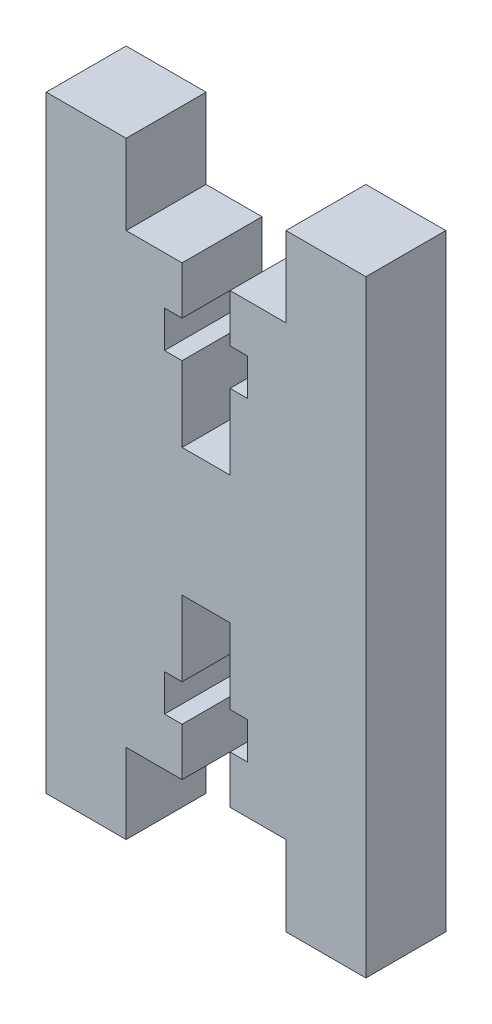
ISO-10303-21;
HEADER;
FILE_DESCRIPTION(('STEP AP214'),'2;1');
FILE_NAME('part.step','',(''),(''),'','','');
FILE_SCHEMA(('AUTOMOTIVE_DESIGN { 1 0 10303 214 1 1 1 1 }'));
ENDSEC;
DATA;
#1=APPLICATION_CONTEXT('core data for automotive mechanical design processes');
#2=APPLICATION_PROTOCOL_DEFINITION('international standard','automotive_design',2000,#1);
#3=PRODUCT_CONTEXT('',#1,'mechanical');
#4=PRODUCT('Part','Part','',(#3));
#5=PRODUCT_RELATED_PRODUCT_CATEGORY('part','',(#4));
#6=PRODUCT_DEFINITION_FORMATION('','',#4);
#7=PRODUCT_DEFINITION_CONTEXT('part definition',#1,'design');
#8=PRODUCT_DEFINITION('design','',#6,#7);
#9=PRODUCT_DEFINITION_SHAPE('','',#8);
#10=(LENGTH_UNIT() NAMED_UNIT(*) SI_UNIT(.MILLI.,.METRE.));
#11=(NAMED_UNIT(*) PLANE_ANGLE_UNIT() SI_UNIT($,.RADIAN.));
#12=(NAMED_UNIT(*) SI_UNIT($,.STERADIAN.) SOLID_ANGLE_UNIT());
#13=UNCERTAINTY_MEASURE_WITH_UNIT(LENGTH_MEASURE(1.E-05),#10,'distance_accuracy_value','');
#14=(GEOMETRIC_REPRESENTATION_CONTEXT(3) GLOBAL_UNCERTAINTY_ASSIGNED_CONTEXT((#13)) GLOBAL_UNIT_ASSIGNED_CONTEXT((#10,
#11,#12)) REPRESENTATION_CONTEXT('',''));
#15=CARTESIAN_POINT('',(0.,0.,0.));
#16=DIRECTION('',(0.,0.,1.));
#17=DIRECTION('',(1.,0.,0.));
#18=AXIS2_PLACEMENT_3D('',#15,#16,#17);
#19=CARTESIAN_POINT('',(0.,11.,5.));
#20=DIRECTION('',(0.,-1.,0.));
#21=DIRECTION('',(1.,0.,0.));
#22=AXIS2_PLACEMENT_3D('',#19,#20,#21);
#23=PLANE('',#22);
#24=DIRECTION('',(-1.,0.,0.));
#25=VECTOR('',#24,1.);
#26=CARTESIAN_POINT('',(0.,11.,0.));
#27=LINE('',#26,#25);
#28=CARTESIAN_POINT('',(-1.5,11.,0.));
#29=VERTEX_POINT('',#28);
#30=CARTESIAN_POINT('',(-2.6,11.,0.));
#31=VERTEX_POINT('',#30);
#32=EDGE_CURVE('E308',#29,#31,#27,.T.);
#33=ORIENTED_EDGE('',*,*,#32,.F.);
#34=DIRECTION('',(0.,0.,-1.));
#35=VECTOR('',#34,1.);
#36=CARTESIAN_POINT('',(-1.5,11.,5.));
#37=LINE('',#36,#35);
#38=CARTESIAN_POINT('',(-1.5,11.,5.));
#39=VERTEX_POINT('',#38);
#40=EDGE_CURVE('E11',#39,#29,#37,.T.);
#41=ORIENTED_EDGE('',*,*,#40,.F.);
#42=DIRECTION('',(-1.,0.,0.));
#43=VECTOR('',#42,1.);
#44=CARTESIAN_POINT('',(0.,11.,5.));
#45=LINE('',#44,#43);
#46=CARTESIAN_POINT('',(-2.6,11.,5.));
#47=VERTEX_POINT('',#46);
#48=EDGE_CURVE('E437',#39,#47,#45,.T.);
#49=ORIENTED_EDGE('',*,*,#48,.T.);
#50=DIRECTION('',(0.,0.,-1.));
#51=VECTOR('',#50,1.);
#52=CARTESIAN_POINT('',(-2.6,11.,5.));
#53=LINE('',#52,#51);
#54=EDGE_CURVE('E58',#47,#31,#53,.T.);
#55=ORIENTED_EDGE('',*,*,#54,.T.);
#56=EDGE_LOOP('',(#33,#41,#49,#55));
#57=FACE_BOUND('',#56,.T.);
#58=ADVANCED_FACE('F41',(#57),#23,.T.);
#59=CARTESIAN_POINT('',(-1.5,0.,5.));
#60=DIRECTION('',(-1.,0.,0.));
#61=DIRECTION('',(0.,-1.,0.));
#62=AXIS2_PLACEMENT_3D('',#59,#60,#61);
#63=PLANE('',#62);
#64=DIRECTION('',(0.,1.,0.));
#65=VECTOR('',#64,1.);
#66=CARTESIAN_POINT('',(-1.5,0.,0.));
#67=LINE('',#66,#65);
#68=CARTESIAN_POINT('',(-1.5,14.,0.));
#69=VERTEX_POINT('',#68);
#70=EDGE_CURVE('E311',#29,#69,#67,.T.);
#71=ORIENTED_EDGE('',*,*,#70,.T.);
#72=DIRECTION('',(0.,0.,-1.));
#73=VECTOR('',#72,1.);
#74=CARTESIAN_POINT('',(-1.5,14.,5.));
#75=LINE('',#74,#73);
#76=CARTESIAN_POINT('',(-1.5,14.,5.));
#77=VERTEX_POINT('',#76);
#78=EDGE_CURVE('E50',#77,#69,#75,.T.);
#79=ORIENTED_EDGE('',*,*,#78,.F.);
#80=DIRECTION('',(0.,1.,0.));
#81=VECTOR('',#80,1.);
#82=CARTESIAN_POINT('',(-1.5,0.,5.));
#83=LINE('',#82,#81);
#84=EDGE_CURVE('E571',#39,#77,#83,.T.);
#85=ORIENTED_EDGE('',*,*,#84,.F.);
#86=ORIENTED_EDGE('',*,*,#40,.T.);
#87=EDGE_LOOP('',(#71,#79,#85,#86));
#88=FACE_BOUND('',#87,.T.);
#89=ADVANCED_FACE('F689',(#88),#63,.F.);
#90=CARTESIAN_POINT('',(0.,14.,5.));
#91=DIRECTION('',(0.,-1.,0.));
#92=DIRECTION('',(1.,0.,0.));
#93=AXIS2_PLACEMENT_3D('',#90,#91,#92);
#94=PLANE('',#93);
#95=DIRECTION('',(-1.,0.,0.));
#96=VECTOR('',#95,1.);
#97=CARTESIAN_POINT('',(0.,14.,0.));
#98=LINE('',#97,#96);
#99=CARTESIAN_POINT('',(-5.,14.,0.));
#100=VERTEX_POINT('',#99);
#101=EDGE_CURVE('E314',#69,#100,#98,.T.);
#102=ORIENTED_EDGE('',*,*,#101,.T.);
#103=DIRECTION('',(0.,0.,-1.));
#104=VECTOR('',#103,1.);
#105=CARTESIAN_POINT('',(-5.,14.,5.));
#106=LINE('',#105,#104);
#107=CARTESIAN_POINT('',(-5.,14.,5.));
#108=VERTEX_POINT('',#107);
#109=EDGE_CURVE('E540',#108,#100,#106,.T.);
#110=ORIENTED_EDGE('',*,*,#109,.F.);
#111=DIRECTION('',(-1.,0.,0.));
#112=VECTOR('',#111,1.);
#113=CARTESIAN_POINT('',(0.,14.,5.));
#114=LINE('',#113,#112);
#115=EDGE_CURVE('E550',#77,#108,#114,.T.);
#116=ORIENTED_EDGE('',*,*,#115,.F.);
#117=ORIENTED_EDGE('',*,*,#78,.T.);
#118=EDGE_LOOP('',(#102,#110,#116,#117));
#119=FACE_BOUND('',#118,.T.);
#120=ADVANCED_FACE('F548',(#119),#94,.F.);
#121=CARTESIAN_POINT('',(-4.99999999999999,0.,5.));
#122=DIRECTION('',(1.,0.,0.));
#123=DIRECTION('',(0.,1.,0.));
#124=AXIS2_PLACEMENT_3D('',#121,#122,#123);
#125=PLANE('',#124);
#126=DIRECTION('',(0.,-1.,0.));
#127=VECTOR('',#126,1.);
#128=CARTESIAN_POINT('',(-4.99999999999999,0.,0.));
#129=LINE('',#128,#127);
#130=CARTESIAN_POINT('',(-5.,19.,0.));
#131=VERTEX_POINT('',#130);
#132=EDGE_CURVE('E318',#131,#100,#129,.T.);
#133=ORIENTED_EDGE('',*,*,#132,.F.);
#134=DIRECTION('',(0.,0.,-1.));
#135=VECTOR('',#134,1.);
#136=CARTESIAN_POINT('',(-5.,19.,5.));
#137=LINE('',#136,#135);
#138=CARTESIAN_POINT('',(-5.,19.,5.));
#139=VERTEX_POINT('',#138);
#140=EDGE_CURVE('E537',#139,#131,#137,.T.);
#141=ORIENTED_EDGE('',*,*,#140,.F.);
#142=DIRECTION('',(0.,-1.,0.));
#143=VECTOR('',#142,1.);
#144=CARTESIAN_POINT('',(-4.99999999999999,0.,5.));
#145=LINE('',#144,#143);
#146=EDGE_CURVE('E563',#139,#108,#145,.T.);
#147=ORIENTED_EDGE('',*,*,#146,.T.);
#148=ORIENTED_EDGE('',*,*,#109,.T.);
#149=EDGE_LOOP('',(#133,#141,#147,#148));
#150=FACE_BOUND('',#149,.T.);
#151=ADVANCED_FACE('F559',(#150),#125,.T.);
#152=CARTESIAN_POINT('',(0.,19.,5.));
#153=DIRECTION('',(0.,-1.,0.));
#154=DIRECTION('',(0.,0.,-1.));
#155=AXIS2_PLACEMENT_3D('',#152,#153,#154);
#156=PLANE('',#155);
#157=DIRECTION('',(-1.,0.,0.));
#158=VECTOR('',#157,1.);
#159=CARTESIAN_POINT('',(0.,19.,0.));
#160=LINE('',#159,#158);
#161=CARTESIAN_POINT('',(-10.,19.,0.));
#162=VERTEX_POINT('',#161);
#163=EDGE_CURVE('E322',#131,#162,#160,.T.);
#164=ORIENTED_EDGE('',*,*,#163,.T.);
#165=DIRECTION('',(0.,0.,-1.));
#166=VECTOR('',#165,1.);
#167=CARTESIAN_POINT('',(-10.,19.,5.));
#168=LINE('',#167,#166);
#169=CARTESIAN_POINT('',(-10.,19.,5.));
#170=VERTEX_POINT('',#169);
#171=EDGE_CURVE('E533',#170,#162,#168,.T.);
#172=ORIENTED_EDGE('',*,*,#171,.F.);
#173=DIRECTION('',(-1.,0.,0.));
#174=VECTOR('',#173,1.);
#175=CARTESIAN_POINT('',(0.,19.,5.));
#176=LINE('',#175,#174);
#177=EDGE_CURVE('E565',#139,#170,#176,.T.);
#178=ORIENTED_EDGE('',*,*,#177,.F.);
#179=ORIENTED_EDGE('',*,*,#140,.T.);
#180=EDGE_LOOP('',(#164,#172,#178,#179));
#181=FACE_BOUND('',#180,.T.);
#182=ADVANCED_FACE('F700',(#181),#156,.F.);
#183=CARTESIAN_POINT('',(-10.,0.,5.));
#184=DIRECTION('',(1.,0.,0.));
#185=DIRECTION('',(0.,0.,-1.));
#186=AXIS2_PLACEMENT_3D('',#183,#184,#185);
#187=PLANE('',#186);
#188=DIRECTION('',(0.,-1.,0.));
#189=VECTOR('',#188,1.);
#190=CARTESIAN_POINT('',(-10.,0.,0.));
#191=LINE('',#190,#189);
#192=CARTESIAN_POINT('',(-10.,-19.,0.));
#193=VERTEX_POINT('',#192);
#194=EDGE_CURVE('E325',#162,#193,#191,.T.);
#195=ORIENTED_EDGE('',*,*,#194,.T.);
#196=DIRECTION('',(0.,0.,-1.));
#197=VECTOR('',#196,1.);
#198=CARTESIAN_POINT('',(-10.,-19.,5.));
#199=LINE('',#198,#197);
#200=CARTESIAN_POINT('',(-10.,-19.,5.));
#201=VERTEX_POINT('',#200);
#202=EDGE_CURVE('E530',#201,#193,#199,.T.);
#203=ORIENTED_EDGE('',*,*,#202,.F.);
#204=DIRECTION('',(0.,-1.,0.));
#205=VECTOR('',#204,1.);
#206=CARTESIAN_POINT('',(-10.,0.,5.));
#207=LINE('',#206,#205);
#208=EDGE_CURVE('E569',#170,#201,#207,.T.);
#209=ORIENTED_EDGE('',*,*,#208,.F.);
#210=ORIENTED_EDGE('',*,*,#171,.T.);
#211=EDGE_LOOP('',(#195,#203,#209,#210));
#212=FACE_BOUND('',#211,.T.);
#213=ADVANCED_FACE('F703',(#212),#187,.F.);
#214=CARTESIAN_POINT('',(0.,-19.,5.));
#215=DIRECTION('',(0.,-1.,0.));
#216=DIRECTION('',(0.,0.,-1.));
#217=AXIS2_PLACEMENT_3D('',#214,#215,#216);
#218=PLANE('',#217);
#219=DIRECTION('',(-1.,0.,0.));
#220=VECTOR('',#219,1.);
#221=CARTESIAN_POINT('',(0.,-19.,0.));
#222=LINE('',#221,#220);
#223=CARTESIAN_POINT('',(-5.,-19.,0.));
#224=VERTEX_POINT('',#223);
#225=EDGE_CURVE('E329',#224,#193,#222,.T.);
#226=ORIENTED_EDGE('',*,*,#225,.F.);
#227=DIRECTION('',(0.,0.,-1.));
#228=VECTOR('',#227,1.);
#229=CARTESIAN_POINT('',(-5.,-19.,5.));
#230=LINE('',#229,#228);
#231=CARTESIAN_POINT('',(-5.,-19.,5.));
#232=VERTEX_POINT('',#231);
#233=EDGE_CURVE('E527',#232,#224,#230,.T.);
#234=ORIENTED_EDGE('',*,*,#233,.F.);
#235=DIRECTION('',(-1.,0.,0.));
#236=VECTOR('',#235,1.);
#237=CARTESIAN_POINT('',(0.,-19.,5.));
#238=LINE('',#237,#236);
#239=EDGE_CURVE('E577',#232,#201,#238,.T.);
#240=ORIENTED_EDGE('',*,*,#239,.T.);
#241=ORIENTED_EDGE('',*,*,#202,.T.);
#242=EDGE_LOOP('',(#226,#234,#240,#241));
#243=FACE_BOUND('',#242,.T.);
#244=ADVANCED_FACE('F707',(#243),#218,.T.);
#245=CARTESIAN_POINT('',(-5.,0.,5.));
#246=DIRECTION('',(-1.,0.,0.));
#247=DIRECTION('',(0.,-1.,0.));
#248=AXIS2_PLACEMENT_3D('',#245,#246,#247);
#249=PLANE('',#248);
#250=DIRECTION('',(0.,1.,0.));
#251=VECTOR('',#250,1.);
#252=CARTESIAN_POINT('',(-5.,0.,0.));
#253=LINE('',#252,#251);
#254=CARTESIAN_POINT('',(-5.,-14.,0.));
#255=VERTEX_POINT('',#254);
#256=EDGE_CURVE('E333',#224,#255,#253,.T.);
#257=ORIENTED_EDGE('',*,*,#256,.T.);
#258=DIRECTION('',(0.,0.,-1.));
#259=VECTOR('',#258,1.);
#260=CARTESIAN_POINT('',(-5.,-14.,5.));
#261=LINE('',#260,#259);
#262=CARTESIAN_POINT('',(-5.,-14.,5.));
#263=VERTEX_POINT('',#262);
#264=EDGE_CURVE('E524',#263,#255,#261,.T.);
#265=ORIENTED_EDGE('',*,*,#264,.F.);
#266=DIRECTION('',(0.,1.,0.));
#267=VECTOR('',#266,1.);
#268=CARTESIAN_POINT('',(-5.,0.,5.));
#269=LINE('',#268,#267);
#270=EDGE_CURVE('E581',#232,#263,#269,.T.);
#271=ORIENTED_EDGE('',*,*,#270,.F.);
#272=ORIENTED_EDGE('',*,*,#233,.T.);
#273=EDGE_LOOP('',(#257,#265,#271,#272));
#274=FACE_BOUND('',#273,.T.);
#275=ADVANCED_FACE('F711',(#274),#249,.F.);
#276=CARTESIAN_POINT('',(0.,-14.,5.));
#277=DIRECTION('',(0.,-1.,0.));
#278=DIRECTION('',(1.,0.,0.));
#279=AXIS2_PLACEMENT_3D('',#276,#277,#278);
#280=PLANE('',#279);
#281=DIRECTION('',(-1.,0.,0.));
#282=VECTOR('',#281,1.);
#283=CARTESIAN_POINT('',(0.,-14.,0.));
#284=LINE('',#283,#282);
#285=CARTESIAN_POINT('',(-1.5,-14.,0.));
#286=VERTEX_POINT('',#285);
#287=EDGE_CURVE('E337',#286,#255,#284,.T.);
#288=ORIENTED_EDGE('',*,*,#287,.F.);
#289=DIRECTION('',(0.,0.,-1.));
#290=VECTOR('',#289,1.);
#291=CARTESIAN_POINT('',(-1.5,-14.,5.));
#292=LINE('',#291,#290);
#293=CARTESIAN_POINT('',(-1.5,-14.,5.));
#294=VERTEX_POINT('',#293);
#295=EDGE_CURVE('E521',#294,#286,#292,.T.);
#296=ORIENTED_EDGE('',*,*,#295,.F.);
#297=DIRECTION('',(-1.,0.,0.));
#298=VECTOR('',#297,1.);
#299=CARTESIAN_POINT('',(0.,-14.,5.));
#300=LINE('',#299,#298);
#301=EDGE_CURVE('E584',#294,#263,#300,.T.);
#302=ORIENTED_EDGE('',*,*,#301,.T.);
#303=ORIENTED_EDGE('',*,*,#264,.T.);
#304=EDGE_LOOP('',(#288,#296,#302,#303));
#305=FACE_BOUND('',#304,.T.);
#306=ADVANCED_FACE('F715',(#305),#280,.T.);
#307=CARTESIAN_POINT('',(-1.5,0.,5.));
#308=DIRECTION('',(1.,0.,0.));
#309=DIRECTION('',(0.,1.,0.));
#310=AXIS2_PLACEMENT_3D('',#307,#308,#309);
#311=PLANE('',#310);
#312=DIRECTION('',(0.,-1.,0.));
#313=VECTOR('',#312,1.);
#314=CARTESIAN_POINT('',(-1.5,0.,0.));
#315=LINE('',#314,#313);
#316=CARTESIAN_POINT('',(-1.5,-11.,0.));
#317=VERTEX_POINT('',#316);
#318=EDGE_CURVE('E341',#317,#286,#315,.T.);
#319=ORIENTED_EDGE('',*,*,#318,.F.);
#320=DIRECTION('',(0.,0.,-1.));
#321=VECTOR('',#320,1.);
#322=CARTESIAN_POINT('',(-1.5,-11.,5.));
#323=LINE('',#322,#321);
#324=CARTESIAN_POINT('',(-1.5,-11.,5.));
#325=VERTEX_POINT('',#324);
#326=EDGE_CURVE('E518',#325,#317,#323,.T.);
#327=ORIENTED_EDGE('',*,*,#326,.F.);
#328=DIRECTION('',(0.,-1.,0.));
#329=VECTOR('',#328,1.);
#330=CARTESIAN_POINT('',(-1.5,0.,5.));
#331=LINE('',#330,#329);
#332=EDGE_CURVE('E588',#325,#294,#331,.T.);
#333=ORIENTED_EDGE('',*,*,#332,.T.);
#334=ORIENTED_EDGE('',*,*,#295,.T.);
#335=EDGE_LOOP('',(#319,#327,#333,#334));
#336=FACE_BOUND('',#335,.T.);
#337=ADVANCED_FACE('F719',(#336),#311,.T.);
#338=CARTESIAN_POINT('',(0.,-11.,5.));
#339=DIRECTION('',(0.,-1.,0.));
#340=DIRECTION('',(1.,0.,0.));
#341=AXIS2_PLACEMENT_3D('',#338,#339,#340);
#342=PLANE('',#341);
#343=DIRECTION('',(-1.,0.,0.));
#344=VECTOR('',#343,1.);
#345=CARTESIAN_POINT('',(0.,-11.,0.));
#346=LINE('',#345,#344);
#347=CARTESIAN_POINT('',(-2.6,-11.,0.));
#348=VERTEX_POINT('',#347);
#349=EDGE_CURVE('E345',#317,#348,#346,.T.);
#350=ORIENTED_EDGE('',*,*,#349,.T.);
#351=DIRECTION('',(0.,0.,-1.));
#352=VECTOR('',#351,1.);
#353=CARTESIAN_POINT('',(-2.6,-11.,5.));
#354=LINE('',#353,#352);
#355=CARTESIAN_POINT('',(-2.6,-11.,5.));
#356=VERTEX_POINT('',#355);
#357=EDGE_CURVE('E514',#356,#348,#354,.T.);
#358=ORIENTED_EDGE('',*,*,#357,.F.);
#359=DIRECTION('',(-1.,0.,0.));
#360=VECTOR('',#359,1.);
#361=CARTESIAN_POINT('',(0.,-11.,5.));
#362=LINE('',#361,#360);
#363=EDGE_CURVE('E592',#325,#356,#362,.T.);
#364=ORIENTED_EDGE('',*,*,#363,.F.);
#365=ORIENTED_EDGE('',*,*,#326,.T.);
#366=EDGE_LOOP('',(#350,#358,#364,#365));
#367=FACE_BOUND('',#366,.T.);
#368=ADVANCED_FACE('F723',(#367),#342,.F.);
#369=CARTESIAN_POINT('',(-2.60000000000001,0.,5.));
#370=DIRECTION('',(-1.,0.,0.));
#371=DIRECTION('',(0.,-1.,0.));
#372=AXIS2_PLACEMENT_3D('',#369,#370,#371);
#373=PLANE('',#372);
#374=DIRECTION('',(0.,1.,0.));
#375=VECTOR('',#374,1.);
#376=CARTESIAN_POINT('',(-2.60000000000001,0.,0.));
#377=LINE('',#376,#375);
#378=CARTESIAN_POINT('',(-2.6,-8.69999999999999,0.));
#379=VERTEX_POINT('',#378);
#380=EDGE_CURVE('E348',#348,#379,#377,.T.);
#381=ORIENTED_EDGE('',*,*,#380,.T.);
#382=DIRECTION('',(0.,0.,-1.));
#383=VECTOR('',#382,1.);
#384=CARTESIAN_POINT('',(-2.6,-8.69999999999999,5.));
#385=LINE('',#384,#383);
#386=CARTESIAN_POINT('',(-2.6,-8.69999999999999,5.));
#387=VERTEX_POINT('',#386);
#388=EDGE_CURVE('E510',#387,#379,#385,.T.);
#389=ORIENTED_EDGE('',*,*,#388,.F.);
#390=DIRECTION('',(0.,1.,0.));
#391=VECTOR('',#390,1.);
#392=CARTESIAN_POINT('',(-2.60000000000001,0.,5.));
#393=LINE('',#392,#391);
#394=EDGE_CURVE('E595',#356,#387,#393,.T.);
#395=ORIENTED_EDGE('',*,*,#394,.F.);
#396=ORIENTED_EDGE('',*,*,#357,.T.);
#397=EDGE_LOOP('',(#381,#389,#395,#396));
#398=FACE_BOUND('',#397,.T.);
#399=ADVANCED_FACE('F727',(#398),#373,.F.);
#400=CARTESIAN_POINT('',(0.,-8.7,5.));
#401=DIRECTION('',(0.,1.,0.));
#402=DIRECTION('',(-1.,0.,0.));
#403=AXIS2_PLACEMENT_3D('',#400,#401,#402);
#404=PLANE('',#403);
#405=DIRECTION('',(1.,0.,0.));
#406=VECTOR('',#405,1.);
#407=CARTESIAN_POINT('',(0.,-8.7,0.));
#408=LINE('',#407,#406);
#409=CARTESIAN_POINT('',(-1.5,-8.7,0.));
#410=VERTEX_POINT('',#409);
#411=EDGE_CURVE('E351',#379,#410,#408,.T.);
#412=ORIENTED_EDGE('',*,*,#411,.T.);
#413=DIRECTION('',(0.,0.,-1.));
#414=VECTOR('',#413,1.);
#415=CARTESIAN_POINT('',(-1.5,-8.7,5.));
#416=LINE('',#415,#414);
#417=CARTESIAN_POINT('',(-1.5,-8.7,5.));
#418=VERTEX_POINT('',#417);
#419=EDGE_CURVE('E507',#418,#410,#416,.T.);
#420=ORIENTED_EDGE('',*,*,#419,.F.);
#421=DIRECTION('',(1.,0.,0.));
#422=VECTOR('',#421,1.);
#423=CARTESIAN_POINT('',(0.,-8.7,5.));
#424=LINE('',#423,#422);
#425=EDGE_CURVE('E598',#387,#418,#424,.T.);
#426=ORIENTED_EDGE('',*,*,#425,.F.);
#427=ORIENTED_EDGE('',*,*,#388,.T.);
#428=EDGE_LOOP('',(#412,#420,#426,#427));
#429=FACE_BOUND('',#428,.T.);
#430=ADVANCED_FACE('F731',(#429),#404,.F.);
#431=CARTESIAN_POINT('',(-1.5,0.,5.));
#432=DIRECTION('',(1.,0.,0.));
#433=DIRECTION('',(0.,1.,0.));
#434=AXIS2_PLACEMENT_3D('',#431,#432,#433);
#435=PLANE('',#434);
#436=DIRECTION('',(0.,-1.,0.));
#437=VECTOR('',#436,1.);
#438=CARTESIAN_POINT('',(-1.5,0.,0.));
#439=LINE('',#438,#437);
#440=CARTESIAN_POINT('',(-1.5,-3.99999999999999,0.));
#441=VERTEX_POINT('',#440);
#442=EDGE_CURVE('E355',#441,#410,#439,.T.);
#443=ORIENTED_EDGE('',*,*,#442,.F.);
#444=DIRECTION('',(0.,0.,-1.));
#445=VECTOR('',#444,1.);
#446=CARTESIAN_POINT('',(-1.5,-3.99999999999999,5.));
#447=LINE('',#446,#445);
#448=CARTESIAN_POINT('',(-1.5,-3.99999999999999,5.));
#449=VERTEX_POINT('',#448);
#450=EDGE_CURVE('E504',#449,#441,#447,.T.);
#451=ORIENTED_EDGE('',*,*,#450,.F.);
#452=DIRECTION('',(0.,-1.,0.));
#453=VECTOR('',#452,1.);
#454=CARTESIAN_POINT('',(-1.5,0.,5.));
#455=LINE('',#454,#453);
#456=EDGE_CURVE('E601',#449,#418,#455,.T.);
#457=ORIENTED_EDGE('',*,*,#456,.T.);
#458=ORIENTED_EDGE('',*,*,#419,.T.);
#459=EDGE_LOOP('',(#443,#451,#457,#458));
#460=FACE_BOUND('',#459,.T.);
#461=ADVANCED_FACE('F735',(#460),#435,.T.);
#462=CARTESIAN_POINT('',(0.,-3.99999999999999,5.));
#463=DIRECTION('',(0.,-1.,0.));
#464=DIRECTION('',(0.,0.,-1.));
#465=AXIS2_PLACEMENT_3D('',#462,#463,#464);
#466=PLANE('',#465);
#467=DIRECTION('',(-1.,0.,0.));
#468=VECTOR('',#467,1.);
#469=CARTESIAN_POINT('',(0.,-3.99999999999999,0.));
#470=LINE('',#469,#468);
#471=CARTESIAN_POINT('',(1.5,-3.99999999999999,0.));
#472=VERTEX_POINT('',#471);
#473=EDGE_CURVE('E359',#472,#441,#470,.T.);
#474=ORIENTED_EDGE('',*,*,#473,.F.);
#475=DIRECTION('',(0.,0.,-1.));
#476=VECTOR('',#475,1.);
#477=CARTESIAN_POINT('',(1.5,-3.99999999999999,5.));
#478=LINE('',#477,#476);
#479=CARTESIAN_POINT('',(1.5,-3.99999999999999,5.));
#480=VERTEX_POINT('',#479);
#481=EDGE_CURVE('E501',#480,#472,#478,.T.);
#482=ORIENTED_EDGE('',*,*,#481,.F.);
#483=DIRECTION('',(-1.,0.,0.));
#484=VECTOR('',#483,1.);
#485=CARTESIAN_POINT('',(0.,-3.99999999999999,5.));
#486=LINE('',#485,#484);
#487=EDGE_CURVE('E605',#480,#449,#486,.T.);
#488=ORIENTED_EDGE('',*,*,#487,.T.);
#489=ORIENTED_EDGE('',*,*,#450,.T.);
#490=EDGE_LOOP('',(#474,#482,#488,#489));
#491=FACE_BOUND('',#490,.T.);
#492=ADVANCED_FACE('F739',(#491),#466,.T.);
#493=CARTESIAN_POINT('',(1.5,0.,5.));
#494=DIRECTION('',(-1.,0.,0.));
#495=DIRECTION('',(0.,-1.,0.));
#496=AXIS2_PLACEMENT_3D('',#493,#494,#495);
#497=PLANE('',#496);
#498=DIRECTION('',(0.,1.,0.));
#499=VECTOR('',#498,1.);
#500=CARTESIAN_POINT('',(1.5,0.,0.));
#501=LINE('',#500,#499);
#502=CARTESIAN_POINT('',(1.5,-8.7,0.));
#503=VERTEX_POINT('',#502);
#504=EDGE_CURVE('E363',#503,#472,#501,.T.);
#505=ORIENTED_EDGE('',*,*,#504,.F.);
#506=DIRECTION('',(0.,0.,-1.));
#507=VECTOR('',#506,1.);
#508=CARTESIAN_POINT('',(1.5,-8.7,5.));
#509=LINE('',#508,#507);
#510=CARTESIAN_POINT('',(1.5,-8.7,5.));
#511=VERTEX_POINT('',#510);
#512=EDGE_CURVE('E498',#511,#503,#509,.T.);
#513=ORIENTED_EDGE('',*,*,#512,.F.);
#514=DIRECTION('',(0.,1.,0.));
#515=VECTOR('',#514,1.);
#516=CARTESIAN_POINT('',(1.5,0.,5.));
#517=LINE('',#516,#515);
#518=EDGE_CURVE('E609',#511,#480,#517,.T.);
#519=ORIENTED_EDGE('',*,*,#518,.T.);
#520=ORIENTED_EDGE('',*,*,#481,.T.);
#521=EDGE_LOOP('',(#505,#513,#519,#520));
#522=FACE_BOUND('',#521,.T.);
#523=ADVANCED_FACE('F743',(#522),#497,.T.);
#524=CARTESIAN_POINT('',(0.,-8.7,5.));
#525=DIRECTION('',(0.,1.,0.));
#526=DIRECTION('',(-1.,0.,0.));
#527=AXIS2_PLACEMENT_3D('',#524,#525,#526);
#528=PLANE('',#527);
#529=DIRECTION('',(1.,0.,0.));
#530=VECTOR('',#529,1.);
#531=CARTESIAN_POINT('',(0.,-8.7,0.));
#532=LINE('',#531,#530);
#533=CARTESIAN_POINT('',(2.6,-8.69999999999999,0.));
#534=VERTEX_POINT('',#533);
#535=EDGE_CURVE('E367',#503,#534,#532,.T.);
#536=ORIENTED_EDGE('',*,*,#535,.T.);
#537=DIRECTION('',(0.,0.,-1.));
#538=VECTOR('',#537,1.);
#539=CARTESIAN_POINT('',(2.6,-8.69999999999999,5.));
#540=LINE('',#539,#538);
#541=CARTESIAN_POINT('',(2.6,-8.69999999999999,5.));
#542=VERTEX_POINT('',#541);
#543=EDGE_CURVE('E494',#542,#534,#540,.T.);
#544=ORIENTED_EDGE('',*,*,#543,.F.);
#545=DIRECTION('',(1.,0.,0.));
#546=VECTOR('',#545,1.);
#547=CARTESIAN_POINT('',(0.,-8.7,5.));
#548=LINE('',#547,#546);
#549=EDGE_CURVE('E613',#511,#542,#548,.T.);
#550=ORIENTED_EDGE('',*,*,#549,.F.);
#551=ORIENTED_EDGE('',*,*,#512,.T.);
#552=EDGE_LOOP('',(#536,#544,#550,#551));
#553=FACE_BOUND('',#552,.T.);
#554=ADVANCED_FACE('F747',(#553),#528,.F.);
#555=CARTESIAN_POINT('',(2.60000000000001,0.,5.));
#556=DIRECTION('',(1.,0.,0.));
#557=DIRECTION('',(0.,1.,0.));
#558=AXIS2_PLACEMENT_3D('',#555,#556,#557);
#559=PLANE('',#558);
#560=DIRECTION('',(0.,-1.,0.));
#561=VECTOR('',#560,1.);
#562=CARTESIAN_POINT('',(2.60000000000001,0.,0.));
#563=LINE('',#562,#561);
#564=CARTESIAN_POINT('',(2.6,-11.,0.));
#565=VERTEX_POINT('',#564);
#566=EDGE_CURVE('E370',#534,#565,#563,.T.);
#567=ORIENTED_EDGE('',*,*,#566,.T.);
#568=DIRECTION('',(0.,0.,-1.));
#569=VECTOR('',#568,1.);
#570=CARTESIAN_POINT('',(2.6,-11.,5.));
#571=LINE('',#570,#569);
#572=CARTESIAN_POINT('',(2.6,-11.,5.));
#573=VERTEX_POINT('',#572);
#574=EDGE_CURVE('E490',#573,#565,#571,.T.);
#575=ORIENTED_EDGE('',*,*,#574,.F.);
#576=DIRECTION('',(0.,-1.,0.));
#577=VECTOR('',#576,1.);
#578=CARTESIAN_POINT('',(2.60000000000001,0.,5.));
#579=LINE('',#578,#577);
#580=EDGE_CURVE('E616',#542,#573,#579,.T.);
#581=ORIENTED_EDGE('',*,*,#580,.F.);
#582=ORIENTED_EDGE('',*,*,#543,.T.);
#583=EDGE_LOOP('',(#567,#575,#581,#582));
#584=FACE_BOUND('',#583,.T.);
#585=ADVANCED_FACE('F751',(#584),#559,.F.);
#586=CARTESIAN_POINT('',(0.,-11.,5.));
#587=DIRECTION('',(0.,-1.,0.));
#588=DIRECTION('',(0.,0.,-1.));
#589=AXIS2_PLACEMENT_3D('',#586,#587,#588);
#590=PLANE('',#589);
#591=DIRECTION('',(-1.,0.,0.));
#592=VECTOR('',#591,1.);
#593=CARTESIAN_POINT('',(0.,-11.,0.));
#594=LINE('',#593,#592);
#595=CARTESIAN_POINT('',(1.5,-11.,0.));
#596=VERTEX_POINT('',#595);
#597=EDGE_CURVE('E373',#565,#596,#594,.T.);
#598=ORIENTED_EDGE('',*,*,#597,.T.);
#599=DIRECTION('',(0.,0.,-1.));
#600=VECTOR('',#599,1.);
#601=CARTESIAN_POINT('',(1.5,-11.,5.));
#602=LINE('',#601,#600);
#603=CARTESIAN_POINT('',(1.5,-11.,5.));
#604=VERTEX_POINT('',#603);
#605=EDGE_CURVE('E487',#604,#596,#602,.T.);
#606=ORIENTED_EDGE('',*,*,#605,.F.);
#607=DIRECTION('',(-1.,0.,0.));
#608=VECTOR('',#607,1.);
#609=CARTESIAN_POINT('',(0.,-11.,5.));
#610=LINE('',#609,#608);
#611=EDGE_CURVE('E619',#573,#604,#610,.T.);
#612=ORIENTED_EDGE('',*,*,#611,.F.);
#613=ORIENTED_EDGE('',*,*,#574,.T.);
#614=EDGE_LOOP('',(#598,#606,#612,#613));
#615=FACE_BOUND('',#614,.T.);
#616=ADVANCED_FACE('F755',(#615),#590,.F.);
#617=CARTESIAN_POINT('',(1.5,0.,5.));
#618=DIRECTION('',(-1.,0.,0.));
#619=DIRECTION('',(0.,0.,1.));
#620=AXIS2_PLACEMENT_3D('',#617,#618,#619);
#621=PLANE('',#620);
#622=DIRECTION('',(0.,1.,0.));
#623=VECTOR('',#622,1.);
#624=CARTESIAN_POINT('',(1.5,0.,0.));
#625=LINE('',#624,#623);
#626=CARTESIAN_POINT('',(1.5,-14.,0.));
#627=VERTEX_POINT('',#626);
#628=EDGE_CURVE('E377',#627,#596,#625,.T.);
#629=ORIENTED_EDGE('',*,*,#628,.F.);
#630=DIRECTION('',(0.,0.,-1.));
#631=VECTOR('',#630,1.);
#632=CARTESIAN_POINT('',(1.5,-14.,5.));
#633=LINE('',#632,#631);
#634=CARTESIAN_POINT('',(1.5,-14.,5.));
#635=VERTEX_POINT('',#634);
#636=EDGE_CURVE('E484',#635,#627,#633,.T.);
#637=ORIENTED_EDGE('',*,*,#636,.F.);
#638=DIRECTION('',(0.,1.,0.));
#639=VECTOR('',#638,1.);
#640=CARTESIAN_POINT('',(1.5,0.,5.));
#641=LINE('',#640,#639);
#642=EDGE_CURVE('E622',#635,#604,#641,.T.);
#643=ORIENTED_EDGE('',*,*,#642,.T.);
#644=ORIENTED_EDGE('',*,*,#605,.T.);
#645=EDGE_LOOP('',(#629,#637,#643,#644));
#646=FACE_BOUND('',#645,.T.);
#647=ADVANCED_FACE('F759',(#646),#621,.T.);
#648=CARTESIAN_POINT('',(0.,-14.,5.));
#649=DIRECTION('',(0.,1.,0.));
#650=DIRECTION('',(0.,0.,1.));
#651=AXIS2_PLACEMENT_3D('',#648,#649,#650);
#652=PLANE('',#651);
#653=DIRECTION('',(1.,0.,0.));
#654=VECTOR('',#653,1.);
#655=CARTESIAN_POINT('',(0.,-14.,0.));
#656=LINE('',#655,#654);
#657=CARTESIAN_POINT('',(5.,-14.,0.));
#658=VERTEX_POINT('',#657);
#659=EDGE_CURVE('E381',#627,#658,#656,.T.);
#660=ORIENTED_EDGE('',*,*,#659,.T.);
#661=DIRECTION('',(0.,0.,-1.));
#662=VECTOR('',#661,1.);
#663=CARTESIAN_POINT('',(5.,-14.,5.));
#664=LINE('',#663,#662);
#665=CARTESIAN_POINT('',(5.,-14.,5.));
#666=VERTEX_POINT('',#665);
#667=EDGE_CURVE('E480',#666,#658,#664,.T.);
#668=ORIENTED_EDGE('',*,*,#667,.F.);
#669=DIRECTION('',(1.,0.,0.));
#670=VECTOR('',#669,1.);
#671=CARTESIAN_POINT('',(0.,-14.,5.));
#672=LINE('',#671,#670);
#673=EDGE_CURVE('E626',#635,#666,#672,.T.);
#674=ORIENTED_EDGE('',*,*,#673,.F.);
#675=ORIENTED_EDGE('',*,*,#636,.T.);
#676=EDGE_LOOP('',(#660,#668,#674,#675));
#677=FACE_BOUND('',#676,.T.);
#678=ADVANCED_FACE('F763',(#677),#652,.F.);
#679=CARTESIAN_POINT('',(5.,0.,5.));
#680=DIRECTION('',(1.,0.,0.));
#681=DIRECTION('',(0.,1.,0.));
#682=AXIS2_PLACEMENT_3D('',#679,#680,#681);
#683=PLANE('',#682);
#684=DIRECTION('',(0.,-1.,0.));
#685=VECTOR('',#684,1.);
#686=CARTESIAN_POINT('',(5.,0.,0.));
#687=LINE('',#686,#685);
#688=CARTESIAN_POINT('',(5.,-19.,0.));
#689=VERTEX_POINT('',#688);
#690=EDGE_CURVE('E384',#658,#689,#687,.T.);
#691=ORIENTED_EDGE('',*,*,#690,.T.);
#692=DIRECTION('',(0.,0.,-1.));
#693=VECTOR('',#692,1.);
#694=CARTESIAN_POINT('',(5.,-19.,5.));
#695=LINE('',#694,#693);
#696=CARTESIAN_POINT('',(5.,-19.,5.));
#697=VERTEX_POINT('',#696);
#698=EDGE_CURVE('E476',#697,#689,#695,.T.);
#699=ORIENTED_EDGE('',*,*,#698,.F.);
#700=DIRECTION('',(0.,-1.,0.));
#701=VECTOR('',#700,1.);
#702=CARTESIAN_POINT('',(5.,0.,5.));
#703=LINE('',#702,#701);
#704=EDGE_CURVE('E629',#666,#697,#703,.T.);
#705=ORIENTED_EDGE('',*,*,#704,.F.);
#706=ORIENTED_EDGE('',*,*,#667,.T.);
#707=EDGE_LOOP('',(#691,#699,#705,#706));
#708=FACE_BOUND('',#707,.T.);
#709=ADVANCED_FACE('F767',(#708),#683,.F.);
#710=CARTESIAN_POINT('',(0.,-19.,5.));
#711=DIRECTION('',(0.,1.,0.));
#712=DIRECTION('',(0.,0.,1.));
#713=AXIS2_PLACEMENT_3D('',#710,#711,#712);
#714=PLANE('',#713);
#715=DIRECTION('',(1.,0.,0.));
#716=VECTOR('',#715,1.);
#717=CARTESIAN_POINT('',(0.,-19.,0.));
#718=LINE('',#717,#716);
#719=CARTESIAN_POINT('',(10.,-19.,0.));
#720=VERTEX_POINT('',#719);
#721=EDGE_CURVE('E387',#689,#720,#718,.T.);
#722=ORIENTED_EDGE('',*,*,#721,.T.);
#723=DIRECTION('',(0.,0.,-1.));
#724=VECTOR('',#723,1.);
#725=CARTESIAN_POINT('',(10.,-19.,5.));
#726=LINE('',#725,#724);
#727=CARTESIAN_POINT('',(10.,-19.,5.));
#728=VERTEX_POINT('',#727);
#729=EDGE_CURVE('E472',#728,#720,#726,.T.);
#730=ORIENTED_EDGE('',*,*,#729,.F.);
#731=DIRECTION('',(1.,0.,0.));
#732=VECTOR('',#731,1.);
#733=CARTESIAN_POINT('',(0.,-19.,5.));
#734=LINE('',#733,#732);
#735=EDGE_CURVE('E632',#697,#728,#734,.T.);
#736=ORIENTED_EDGE('',*,*,#735,.F.);
#737=ORIENTED_EDGE('',*,*,#698,.T.);
#738=EDGE_LOOP('',(#722,#730,#736,#737));
#739=FACE_BOUND('',#738,.T.);
#740=ADVANCED_FACE('F771',(#739),#714,.F.);
#741=CARTESIAN_POINT('',(10.,0.,5.));
#742=DIRECTION('',(-1.,0.,0.));
#743=DIRECTION('',(0.,0.,1.));
#744=AXIS2_PLACEMENT_3D('',#741,#742,#743);
#745=PLANE('',#744);
#746=DIRECTION('',(0.,1.,0.));
#747=VECTOR('',#746,1.);
#748=CARTESIAN_POINT('',(10.,0.,0.));
#749=LINE('',#748,#747);
#750=CARTESIAN_POINT('',(10.,19.,0.));
#751=VERTEX_POINT('',#750);
#752=EDGE_CURVE('E390',#720,#751,#749,.T.);
#753=ORIENTED_EDGE('',*,*,#752,.T.);
#754=DIRECTION('',(0.,0.,-1.));
#755=VECTOR('',#754,1.);
#756=CARTESIAN_POINT('',(10.,19.,5.));
#757=LINE('',#756,#755);
#758=CARTESIAN_POINT('',(10.,19.,5.));
#759=VERTEX_POINT('',#758);
#760=EDGE_CURVE('E469',#759,#751,#757,.T.);
#761=ORIENTED_EDGE('',*,*,#760,.F.);
#762=DIRECTION('',(0.,1.,0.));
#763=VECTOR('',#762,1.);
#764=CARTESIAN_POINT('',(10.,0.,5.));
#765=LINE('',#764,#763);
#766=EDGE_CURVE('E635',#728,#759,#765,.T.);
#767=ORIENTED_EDGE('',*,*,#766,.F.);
#768=ORIENTED_EDGE('',*,*,#729,.T.);
#769=EDGE_LOOP('',(#753,#761,#767,#768));
#770=FACE_BOUND('',#769,.T.);
#771=ADVANCED_FACE('F775',(#770),#745,.F.);
#772=CARTESIAN_POINT('',(0.,19.,5.));
#773=DIRECTION('',(0.,1.,0.));
#774=DIRECTION('',(0.,0.,1.));
#775=AXIS2_PLACEMENT_3D('',#772,#773,#774);
#776=PLANE('',#775);
#777=DIRECTION('',(1.,0.,0.));
#778=VECTOR('',#777,1.);
#779=CARTESIAN_POINT('',(0.,19.,0.));
#780=LINE('',#779,#778);
#781=CARTESIAN_POINT('',(5.,19.,0.));
#782=VERTEX_POINT('',#781);
#783=EDGE_CURVE('E394',#782,#751,#780,.T.);
#784=ORIENTED_EDGE('',*,*,#783,.F.);
#785=DIRECTION('',(0.,0.,-1.));
#786=VECTOR('',#785,1.);
#787=CARTESIAN_POINT('',(5.,19.,5.));
#788=LINE('',#787,#786);
#789=CARTESIAN_POINT('',(5.,19.,5.));
#790=VERTEX_POINT('',#789);
#791=EDGE_CURVE('E466',#790,#782,#788,.T.);
#792=ORIENTED_EDGE('',*,*,#791,.F.);
#793=DIRECTION('',(1.,0.,0.));
#794=VECTOR('',#793,1.);
#795=CARTESIAN_POINT('',(0.,19.,5.));
#796=LINE('',#795,#794);
#797=EDGE_CURVE('E638',#790,#759,#796,.T.);
#798=ORIENTED_EDGE('',*,*,#797,.T.);
#799=ORIENTED_EDGE('',*,*,#760,.T.);
#800=EDGE_LOOP('',(#784,#792,#798,#799));
#801=FACE_BOUND('',#800,.T.);
#802=ADVANCED_FACE('F779',(#801),#776,.T.);
#803=CARTESIAN_POINT('',(5.,0.,5.));
#804=DIRECTION('',(-1.,0.,0.));
#805=DIRECTION('',(0.,0.,1.));
#806=AXIS2_PLACEMENT_3D('',#803,#804,#805);
#807=PLANE('',#806);
#808=DIRECTION('',(0.,1.,0.));
#809=VECTOR('',#808,1.);
#810=CARTESIAN_POINT('',(5.,0.,0.));
#811=LINE('',#810,#809);
#812=CARTESIAN_POINT('',(5.,14.,0.));
#813=VERTEX_POINT('',#812);
#814=EDGE_CURVE('E398',#813,#782,#811,.T.);
#815=ORIENTED_EDGE('',*,*,#814,.F.);
#816=DIRECTION('',(0.,0.,-1.));
#817=VECTOR('',#816,1.);
#818=CARTESIAN_POINT('',(5.,14.,5.));
#819=LINE('',#818,#817);
#820=CARTESIAN_POINT('',(5.,14.,5.));
#821=VERTEX_POINT('',#820);
#822=EDGE_CURVE('E463',#821,#813,#819,.T.);
#823=ORIENTED_EDGE('',*,*,#822,.F.);
#824=DIRECTION('',(0.,1.,0.));
#825=VECTOR('',#824,1.);
#826=CARTESIAN_POINT('',(5.,0.,5.));
#827=LINE('',#826,#825);
#828=EDGE_CURVE('E642',#821,#790,#827,.T.);
#829=ORIENTED_EDGE('',*,*,#828,.T.);
#830=ORIENTED_EDGE('',*,*,#791,.T.);
#831=EDGE_LOOP('',(#815,#823,#829,#830));
#832=FACE_BOUND('',#831,.T.);
#833=ADVANCED_FACE('F783',(#832),#807,.T.);
#834=CARTESIAN_POINT('',(0.,14.,5.));
#835=DIRECTION('',(0.,1.,0.));
#836=DIRECTION('',(0.,0.,1.));
#837=AXIS2_PLACEMENT_3D('',#834,#835,#836);
#838=PLANE('',#837);
#839=DIRECTION('',(1.,0.,0.));
#840=VECTOR('',#839,1.);
#841=CARTESIAN_POINT('',(0.,14.,0.));
#842=LINE('',#841,#840);
#843=CARTESIAN_POINT('',(1.5,14.,0.));
#844=VERTEX_POINT('',#843);
#845=EDGE_CURVE('E402',#844,#813,#842,.T.);
#846=ORIENTED_EDGE('',*,*,#845,.F.);
#847=DIRECTION('',(0.,0.,-1.));
#848=VECTOR('',#847,1.);
#849=CARTESIAN_POINT('',(1.5,14.,5.));
#850=LINE('',#849,#848);
#851=CARTESIAN_POINT('',(1.5,14.,5.));
#852=VERTEX_POINT('',#851);
#853=EDGE_CURVE('E460',#852,#844,#850,.T.);
#854=ORIENTED_EDGE('',*,*,#853,.F.);
#855=DIRECTION('',(1.,0.,0.));
#856=VECTOR('',#855,1.);
#857=CARTESIAN_POINT('',(0.,14.,5.));
#858=LINE('',#857,#856);
#859=EDGE_CURVE('E646',#852,#821,#858,.T.);
#860=ORIENTED_EDGE('',*,*,#859,.T.);
#861=ORIENTED_EDGE('',*,*,#822,.T.);
#862=EDGE_LOOP('',(#846,#854,#860,#861));
#863=FACE_BOUND('',#862,.T.);
#864=ADVANCED_FACE('F787',(#863),#838,.T.);
#865=CARTESIAN_POINT('',(1.5,0.,5.));
#866=DIRECTION('',(1.,0.,0.));
#867=DIRECTION('',(0.,0.,-1.));
#868=AXIS2_PLACEMENT_3D('',#865,#866,#867);
#869=PLANE('',#868);
#870=DIRECTION('',(0.,-1.,0.));
#871=VECTOR('',#870,1.);
#872=CARTESIAN_POINT('',(1.5,0.,0.));
#873=LINE('',#872,#871);
#874=CARTESIAN_POINT('',(1.5,11.,0.));
#875=VERTEX_POINT('',#874);
#876=EDGE_CURVE('E406',#844,#875,#873,.T.);
#877=ORIENTED_EDGE('',*,*,#876,.T.);
#878=DIRECTION('',(0.,0.,-1.));
#879=VECTOR('',#878,1.);
#880=CARTESIAN_POINT('',(1.5,11.,5.));
#881=LINE('',#880,#879);
#882=CARTESIAN_POINT('',(1.5,11.,5.));
#883=VERTEX_POINT('',#882);
#884=EDGE_CURVE('E457',#883,#875,#881,.T.);
#885=ORIENTED_EDGE('',*,*,#884,.F.);
#886=DIRECTION('',(0.,-1.,0.));
#887=VECTOR('',#886,1.);
#888=CARTESIAN_POINT('',(1.5,0.,5.));
#889=LINE('',#888,#887);
#890=EDGE_CURVE('E650',#852,#883,#889,.T.);
#891=ORIENTED_EDGE('',*,*,#890,.F.);
#892=ORIENTED_EDGE('',*,*,#853,.T.);
#893=EDGE_LOOP('',(#877,#885,#891,#892));
#894=FACE_BOUND('',#893,.T.);
#895=ADVANCED_FACE('F791',(#894),#869,.F.);
#896=CARTESIAN_POINT('',(0.,11.,5.));
#897=DIRECTION('',(0.,-1.,0.));
#898=DIRECTION('',(0.,0.,-1.));
#899=AXIS2_PLACEMENT_3D('',#896,#897,#898);
#900=PLANE('',#899);
#901=DIRECTION('',(-1.,0.,0.));
#902=VECTOR('',#901,1.);
#903=CARTESIAN_POINT('',(0.,11.,0.));
#904=LINE('',#903,#902);
#905=CARTESIAN_POINT('',(2.6,11.,0.));
#906=VERTEX_POINT('',#905);
#907=EDGE_CURVE('E410',#906,#875,#904,.T.);
#908=ORIENTED_EDGE('',*,*,#907,.F.);
#909=DIRECTION('',(0.,0.,-1.));
#910=VECTOR('',#909,1.);
#911=CARTESIAN_POINT('',(2.6,11.,5.));
#912=LINE('',#911,#910);
#913=CARTESIAN_POINT('',(2.6,11.,5.));
#914=VERTEX_POINT('',#913);
#915=EDGE_CURVE('E454',#914,#906,#912,.T.);
#916=ORIENTED_EDGE('',*,*,#915,.F.);
#917=DIRECTION('',(-1.,0.,0.));
#918=VECTOR('',#917,1.);
#919=CARTESIAN_POINT('',(0.,11.,5.));
#920=LINE('',#919,#918);
#921=EDGE_CURVE('E653',#914,#883,#920,.T.);
#922=ORIENTED_EDGE('',*,*,#921,.T.);
#923=ORIENTED_EDGE('',*,*,#884,.T.);
#924=EDGE_LOOP('',(#908,#916,#922,#923));
#925=FACE_BOUND('',#924,.T.);
#926=ADVANCED_FACE('F795',(#925),#900,.T.);
#927=CARTESIAN_POINT('',(2.60000000000001,0.,5.));
#928=DIRECTION('',(-1.,0.,0.));
#929=DIRECTION('',(0.,-1.,0.));
#930=AXIS2_PLACEMENT_3D('',#927,#928,#929);
#931=PLANE('',#930);
#932=DIRECTION('',(0.,1.,0.));
#933=VECTOR('',#932,1.);
#934=CARTESIAN_POINT('',(2.60000000000001,0.,0.));
#935=LINE('',#934,#933);
#936=CARTESIAN_POINT('',(2.6,8.70000000000001,0.));
#937=VERTEX_POINT('',#936);
#938=EDGE_CURVE('E414',#937,#906,#935,.T.);
#939=ORIENTED_EDGE('',*,*,#938,.F.);
#940=DIRECTION('',(0.,0.,-1.));
#941=VECTOR('',#940,1.);
#942=CARTESIAN_POINT('',(2.6,8.70000000000001,5.));
#943=LINE('',#942,#941);
#944=CARTESIAN_POINT('',(2.6,8.70000000000001,5.));
#945=VERTEX_POINT('',#944);
#946=EDGE_CURVE('E451',#945,#937,#943,.T.);
#947=ORIENTED_EDGE('',*,*,#946,.F.);
#948=DIRECTION('',(0.,1.,0.));
#949=VECTOR('',#948,1.);
#950=CARTESIAN_POINT('',(2.60000000000001,0.,5.));
#951=LINE('',#950,#949);
#952=EDGE_CURVE('E657',#945,#914,#951,.T.);
#953=ORIENTED_EDGE('',*,*,#952,.T.);
#954=ORIENTED_EDGE('',*,*,#915,.T.);
#955=EDGE_LOOP('',(#939,#947,#953,#954));
#956=FACE_BOUND('',#955,.T.);
#957=ADVANCED_FACE('F799',(#956),#931,.T.);
#958=CARTESIAN_POINT('',(0.,8.70000000000002,5.));
#959=DIRECTION('',(0.,1.,0.));
#960=DIRECTION('',(-1.,0.,0.));
#961=AXIS2_PLACEMENT_3D('',#958,#959,#960);
#962=PLANE('',#961);
#963=DIRECTION('',(1.,0.,0.));
#964=VECTOR('',#963,1.);
#965=CARTESIAN_POINT('',(0.,8.70000000000002,0.));
#966=LINE('',#965,#964);
#967=CARTESIAN_POINT('',(1.5,8.70000000000001,0.));
#968=VERTEX_POINT('',#967);
#969=EDGE_CURVE('E418',#968,#937,#966,.T.);
#970=ORIENTED_EDGE('',*,*,#969,.F.);
#971=DIRECTION('',(0.,0.,-1.));
#972=VECTOR('',#971,1.);
#973=CARTESIAN_POINT('',(1.5,8.70000000000001,5.));
#974=LINE('',#973,#972);
#975=CARTESIAN_POINT('',(1.5,8.70000000000001,5.));
#976=VERTEX_POINT('',#975);
#977=EDGE_CURVE('E448',#976,#968,#974,.T.);
#978=ORIENTED_EDGE('',*,*,#977,.F.);
#979=DIRECTION('',(1.,0.,0.));
#980=VECTOR('',#979,1.);
#981=CARTESIAN_POINT('',(0.,8.70000000000002,5.));
#982=LINE('',#981,#980);
#983=EDGE_CURVE('E661',#976,#945,#982,.T.);
#984=ORIENTED_EDGE('',*,*,#983,.T.);
#985=ORIENTED_EDGE('',*,*,#946,.T.);
#986=EDGE_LOOP('',(#970,#978,#984,#985));
#987=FACE_BOUND('',#986,.T.);
#988=ADVANCED_FACE('F803',(#987),#962,.T.);
#989=CARTESIAN_POINT('',(1.5,0.,5.));
#990=DIRECTION('',(1.,0.,0.));
#991=DIRECTION('',(0.,1.,0.));
#992=AXIS2_PLACEMENT_3D('',#989,#990,#991);
#993=PLANE('',#992);
#994=DIRECTION('',(0.,-1.,0.));
#995=VECTOR('',#994,1.);
#996=CARTESIAN_POINT('',(1.5,0.,0.));
#997=LINE('',#996,#995);
#998=CARTESIAN_POINT('',(1.5,4.00000000000001,0.));
#999=VERTEX_POINT('',#998);
#1000=EDGE_CURVE('E422',#968,#999,#997,.T.);
#1001=ORIENTED_EDGE('',*,*,#1000,.T.);
#1002=DIRECTION('',(0.,0.,-1.));
#1003=VECTOR('',#1002,1.);
#1004=CARTESIAN_POINT('',(1.5,4.00000000000001,5.));
#1005=LINE('',#1004,#1003);
#1006=CARTESIAN_POINT('',(1.5,4.00000000000001,5.));
#1007=VERTEX_POINT('',#1006);
#1008=EDGE_CURVE('E444',#1007,#999,#1005,.T.);
#1009=ORIENTED_EDGE('',*,*,#1008,.F.);
#1010=DIRECTION('',(0.,-1.,0.));
#1011=VECTOR('',#1010,1.);
#1012=CARTESIAN_POINT('',(1.5,0.,5.));
#1013=LINE('',#1012,#1011);
#1014=EDGE_CURVE('E665',#976,#1007,#1013,.T.);
#1015=ORIENTED_EDGE('',*,*,#1014,.F.);
#1016=ORIENTED_EDGE('',*,*,#977,.T.);
#1017=EDGE_LOOP('',(#1001,#1009,#1015,#1016));
#1018=FACE_BOUND('',#1017,.T.);
#1019=ADVANCED_FACE('F673',(#1018),#993,.F.);
#1020=CARTESIAN_POINT('',(0.,4.00000000000001,5.));
#1021=DIRECTION('',(0.,-1.,0.));
#1022=DIRECTION('',(0.,0.,-1.));
#1023=AXIS2_PLACEMENT_3D('',#1020,#1021,#1022);
#1024=PLANE('',#1023);
#1025=DIRECTION('',(-1.,0.,0.));
#1026=VECTOR('',#1025,1.);
#1027=CARTESIAN_POINT('',(0.,4.00000000000001,0.));
#1028=LINE('',#1027,#1026);
#1029=CARTESIAN_POINT('',(-1.5,4.00000000000001,0.));
#1030=VERTEX_POINT('',#1029);
#1031=EDGE_CURVE('E425',#999,#1030,#1028,.T.);
#1032=ORIENTED_EDGE('',*,*,#1031,.T.);
#1033=DIRECTION('',(0.,0.,-1.));
#1034=VECTOR('',#1033,1.);
#1035=CARTESIAN_POINT('',(-1.5,4.00000000000001,5.));
#1036=LINE('',#1035,#1034);
#1037=CARTESIAN_POINT('',(-1.5,4.00000000000001,5.));
#1038=VERTEX_POINT('',#1037);
#1039=EDGE_CURVE('E298',#1038,#1030,#1036,.T.);
#1040=ORIENTED_EDGE('',*,*,#1039,.F.);
#1041=DIRECTION('',(-1.,0.,0.));
#1042=VECTOR('',#1041,1.);
#1043=CARTESIAN_POINT('',(0.,4.00000000000001,5.));
#1044=LINE('',#1043,#1042);
#1045=EDGE_CURVE('E284',#1007,#1038,#1044,.T.);
#1046=ORIENTED_EDGE('',*,*,#1045,.F.);
#1047=ORIENTED_EDGE('',*,*,#1008,.T.);
#1048=EDGE_LOOP('',(#1032,#1040,#1046,#1047));
#1049=FACE_BOUND('',#1048,.T.);
#1050=ADVANCED_FACE('F677',(#1049),#1024,.F.);
#1051=CARTESIAN_POINT('',(-1.5,0.,5.));
#1052=DIRECTION('',(-1.,0.,0.));
#1053=DIRECTION('',(0.,-1.,0.));
#1054=AXIS2_PLACEMENT_3D('',#1051,#1052,#1053);
#1055=PLANE('',#1054);
#1056=DIRECTION('',(0.,1.,0.));
#1057=VECTOR('',#1056,1.);
#1058=CARTESIAN_POINT('',(-1.5,0.,0.));
#1059=LINE('',#1058,#1057);
#1060=CARTESIAN_POINT('',(-1.5,8.70000000000001,0.));
#1061=VERTEX_POINT('',#1060);
#1062=EDGE_CURVE('E294',#1030,#1061,#1059,.T.);
#1063=ORIENTED_EDGE('',*,*,#1062,.T.);
#1064=DIRECTION('',(0.,0.,-1.));
#1065=VECTOR('',#1064,1.);
#1066=CARTESIAN_POINT('',(-1.5,8.70000000000001,5.));
#1067=LINE('',#1066,#1065);
#1068=CARTESIAN_POINT('',(-1.5,8.70000000000001,5.));
#1069=VERTEX_POINT('',#1068);
#1070=EDGE_CURVE('E291',#1069,#1061,#1067,.T.);
#1071=ORIENTED_EDGE('',*,*,#1070,.F.);
#1072=DIRECTION('',(0.,1.,0.));
#1073=VECTOR('',#1072,1.);
#1074=CARTESIAN_POINT('',(-1.5,0.,5.));
#1075=LINE('',#1074,#1073);
#1076=EDGE_CURVE('E276',#1038,#1069,#1075,.T.);
#1077=ORIENTED_EDGE('',*,*,#1076,.F.);
#1078=ORIENTED_EDGE('',*,*,#1039,.T.);
#1079=EDGE_LOOP('',(#1063,#1071,#1077,#1078));
#1080=FACE_BOUND('',#1079,.T.);
#1081=ADVANCED_FACE('F292',(#1080),#1055,.F.);
#1082=CARTESIAN_POINT('',(0.,8.70000000000002,5.));
#1083=DIRECTION('',(0.,1.,0.));
#1084=DIRECTION('',(-1.,0.,0.));
#1085=AXIS2_PLACEMENT_3D('',#1082,#1083,#1084);
#1086=PLANE('',#1085);
#1087=DIRECTION('',(1.,0.,0.));
#1088=VECTOR('',#1087,1.);
#1089=CARTESIAN_POINT('',(0.,8.70000000000002,0.));
#1090=LINE('',#1089,#1088);
#1091=CARTESIAN_POINT('',(-2.6,8.70000000000001,0.));
#1092=VERTEX_POINT('',#1091);
#1093=EDGE_CURVE('E430',#1092,#1061,#1090,.T.);
#1094=ORIENTED_EDGE('',*,*,#1093,.F.);
#1095=DIRECTION('',(0.,0.,-1.));
#1096=VECTOR('',#1095,1.);
#1097=CARTESIAN_POINT('',(-2.6,8.70000000000001,5.));
#1098=LINE('',#1097,#1096);
#1099=CARTESIAN_POINT('',(-2.6,8.70000000000001,5.));
#1100=VERTEX_POINT('',#1099);
#1101=EDGE_CURVE('E167',#1100,#1092,#1098,.T.);
#1102=ORIENTED_EDGE('',*,*,#1101,.F.);
#1103=DIRECTION('',(1.,0.,0.));
#1104=VECTOR('',#1103,1.);
#1105=CARTESIAN_POINT('',(0.,8.70000000000002,5.));
#1106=LINE('',#1105,#1104);
#1107=EDGE_CURVE('E282',#1100,#1069,#1106,.T.);
#1108=ORIENTED_EDGE('',*,*,#1107,.T.);
#1109=ORIENTED_EDGE('',*,*,#1070,.T.);
#1110=EDGE_LOOP('',(#1094,#1102,#1108,#1109));
#1111=FACE_BOUND('',#1110,.T.);
#1112=ADVANCED_FACE('F300',(#1111),#1086,.T.);
#1113=CARTESIAN_POINT('',(-2.60000000000001,0.,5.));
#1114=DIRECTION('',(1.,0.,0.));
#1115=DIRECTION('',(0.,1.,0.));
#1116=AXIS2_PLACEMENT_3D('',#1113,#1114,#1115);
#1117=PLANE('',#1116);
#1118=DIRECTION('',(0.,-1.,0.));
#1119=VECTOR('',#1118,1.);
#1120=CARTESIAN_POINT('',(-2.60000000000001,0.,0.));
#1121=LINE('',#1120,#1119);
#1122=EDGE_CURVE('E433',#31,#1092,#1121,.T.);
#1123=ORIENTED_EDGE('',*,*,#1122,.F.);
#1124=ORIENTED_EDGE('',*,*,#54,.F.);
#1125=DIRECTION('',(0.,-1.,0.));
#1126=VECTOR('',#1125,1.);
#1127=CARTESIAN_POINT('',(-2.60000000000001,0.,5.));
#1128=LINE('',#1127,#1126);
#1129=EDGE_CURVE('E302',#47,#1100,#1128,.T.);
#1130=ORIENTED_EDGE('',*,*,#1129,.T.);
#1131=ORIENTED_EDGE('',*,*,#1101,.T.);
#1132=EDGE_LOOP('',(#1123,#1124,#1130,#1131));
#1133=FACE_BOUND('',#1132,.T.);
#1134=ADVANCED_FACE('F678',(#1133),#1117,.T.);
#1135=CARTESIAN_POINT('',(0.,0.,5.));
#1136=DIRECTION('',(0.,0.,1.));
#1137=DIRECTION('',(1.,0.,0.));
#1138=AXIS2_PLACEMENT_3D('',#1135,#1136,#1137);
#1139=PLANE('',#1138);
#1140=ORIENTED_EDGE('',*,*,#48,.F.);
#1141=ORIENTED_EDGE('',*,*,#84,.T.);
#1142=ORIENTED_EDGE('',*,*,#115,.T.);
#1143=ORIENTED_EDGE('',*,*,#146,.F.);
#1144=ORIENTED_EDGE('',*,*,#177,.T.);
#1145=ORIENTED_EDGE('',*,*,#208,.T.);
#1146=ORIENTED_EDGE('',*,*,#239,.F.);
#1147=ORIENTED_EDGE('',*,*,#270,.T.);
#1148=ORIENTED_EDGE('',*,*,#301,.F.);
#1149=ORIENTED_EDGE('',*,*,#332,.F.);
#1150=ORIENTED_EDGE('',*,*,#363,.T.);
#1151=ORIENTED_EDGE('',*,*,#394,.T.);
#1152=ORIENTED_EDGE('',*,*,#425,.T.);
#1153=ORIENTED_EDGE('',*,*,#456,.F.);
#1154=ORIENTED_EDGE('',*,*,#487,.F.);
#1155=ORIENTED_EDGE('',*,*,#518,.F.);
#1156=ORIENTED_EDGE('',*,*,#549,.T.);
#1157=ORIENTED_EDGE('',*,*,#580,.T.);
#1158=ORIENTED_EDGE('',*,*,#611,.T.);
#1159=ORIENTED_EDGE('',*,*,#642,.F.);
#1160=ORIENTED_EDGE('',*,*,#673,.T.);
#1161=ORIENTED_EDGE('',*,*,#704,.T.);
#1162=ORIENTED_EDGE('',*,*,#735,.T.);
#1163=ORIENTED_EDGE('',*,*,#766,.T.);
#1164=ORIENTED_EDGE('',*,*,#797,.F.);
#1165=ORIENTED_EDGE('',*,*,#828,.F.);
#1166=ORIENTED_EDGE('',*,*,#859,.F.);
#1167=ORIENTED_EDGE('',*,*,#890,.T.);
#1168=ORIENTED_EDGE('',*,*,#921,.F.);
#1169=ORIENTED_EDGE('',*,*,#952,.F.);
#1170=ORIENTED_EDGE('',*,*,#983,.F.);
#1171=ORIENTED_EDGE('',*,*,#1014,.T.);
#1172=ORIENTED_EDGE('',*,*,#1045,.T.);
#1173=ORIENTED_EDGE('',*,*,#1076,.T.);
#1174=ORIENTED_EDGE('',*,*,#1107,.F.);
#1175=ORIENTED_EDGE('',*,*,#1129,.F.);
#1176=EDGE_LOOP('',(#1140,#1141,#1142,#1143,#1144,#1145,#1146,#1147,#1148,#1149,#1150,#1151,
#1152,#1153,#1154,#1155,#1156,#1157,#1158,#1159,#1160,#1161,#1162,#1163,#1164,#1165,#1166,#1167,
#1168,#1169,#1170,#1171,#1172,#1173,#1174,#1175));
#1177=FACE_BOUND('',#1176,.T.);
#1178=ADVANCED_FACE('F279',(#1177),#1139,.T.);
#1179=CARTESIAN_POINT('',(0.,0.,0.));
#1180=DIRECTION('',(0.,0.,1.));
#1181=DIRECTION('',(1.,0.,0.));
#1182=AXIS2_PLACEMENT_3D('',#1179,#1180,#1181);
#1183=PLANE('',#1182);
#1184=ORIENTED_EDGE('',*,*,#32,.T.);
#1185=ORIENTED_EDGE('',*,*,#1122,.T.);
#1186=ORIENTED_EDGE('',*,*,#1093,.T.);
#1187=ORIENTED_EDGE('',*,*,#1062,.F.);
#1188=ORIENTED_EDGE('',*,*,#1031,.F.);
#1189=ORIENTED_EDGE('',*,*,#1000,.F.);
#1190=ORIENTED_EDGE('',*,*,#969,.T.);
#1191=ORIENTED_EDGE('',*,*,#938,.T.);
#1192=ORIENTED_EDGE('',*,*,#907,.T.);
#1193=ORIENTED_EDGE('',*,*,#876,.F.);
#1194=ORIENTED_EDGE('',*,*,#845,.T.);
#1195=ORIENTED_EDGE('',*,*,#814,.T.);
#1196=ORIENTED_EDGE('',*,*,#783,.T.);
#1197=ORIENTED_EDGE('',*,*,#752,.F.);
#1198=ORIENTED_EDGE('',*,*,#721,.F.);
#1199=ORIENTED_EDGE('',*,*,#690,.F.);
#1200=ORIENTED_EDGE('',*,*,#659,.F.);
#1201=ORIENTED_EDGE('',*,*,#628,.T.);
#1202=ORIENTED_EDGE('',*,*,#597,.F.);
#1203=ORIENTED_EDGE('',*,*,#566,.F.);
#1204=ORIENTED_EDGE('',*,*,#535,.F.);
#1205=ORIENTED_EDGE('',*,*,#504,.T.);
#1206=ORIENTED_EDGE('',*,*,#473,.T.);
#1207=ORIENTED_EDGE('',*,*,#442,.T.);
#1208=ORIENTED_EDGE('',*,*,#411,.F.);
#1209=ORIENTED_EDGE('',*,*,#380,.F.);
#1210=ORIENTED_EDGE('',*,*,#349,.F.);
#1211=ORIENTED_EDGE('',*,*,#318,.T.);
#1212=ORIENTED_EDGE('',*,*,#287,.T.);
#1213=ORIENTED_EDGE('',*,*,#256,.F.);
#1214=ORIENTED_EDGE('',*,*,#225,.T.);
#1215=ORIENTED_EDGE('',*,*,#194,.F.);
#1216=ORIENTED_EDGE('',*,*,#163,.F.);
#1217=ORIENTED_EDGE('',*,*,#132,.T.);
#1218=ORIENTED_EDGE('',*,*,#101,.F.);
#1219=ORIENTED_EDGE('',*,*,#70,.F.);
#1220=EDGE_LOOP('',(#1184,#1185,#1186,#1187,#1188,#1189,#1190,#1191,#1192,#1193,#1194,#1195,
#1196,#1197,#1198,#1199,#1200,#1201,#1202,#1203,#1204,#1205,#1206,#1207,#1208,#1209,#1210,#1211,
#1212,#1213,#1214,#1215,#1216,#1217,#1218,#1219));
#1221=FACE_BOUND('',#1220,.T.);
#1222=ADVANCED_FACE('F554',(#1221),#1183,.F.);
#1223=CLOSED_SHELL('',(#58,#89,#120,#151,#182,#213,#244,#275,#306,#337,#368,#399,#430,#461,#492,
#523,#554,#585,#616,#647,#678,#709,#740,#771,#802,#833,#864,#895,#926,#957,#988,#1019,#1050,
#1081,#1112,#1134,#1178,#1222));
#1224=MANIFOLD_SOLID_BREP('B2',#1223);
#1225=ADVANCED_BREP_SHAPE_REPRESENTATION('',(#18,#1224),#14);
#1226=SHAPE_DEFINITION_REPRESENTATION(#9,#1225);
ENDSEC;
END-ISO-10303-21;
